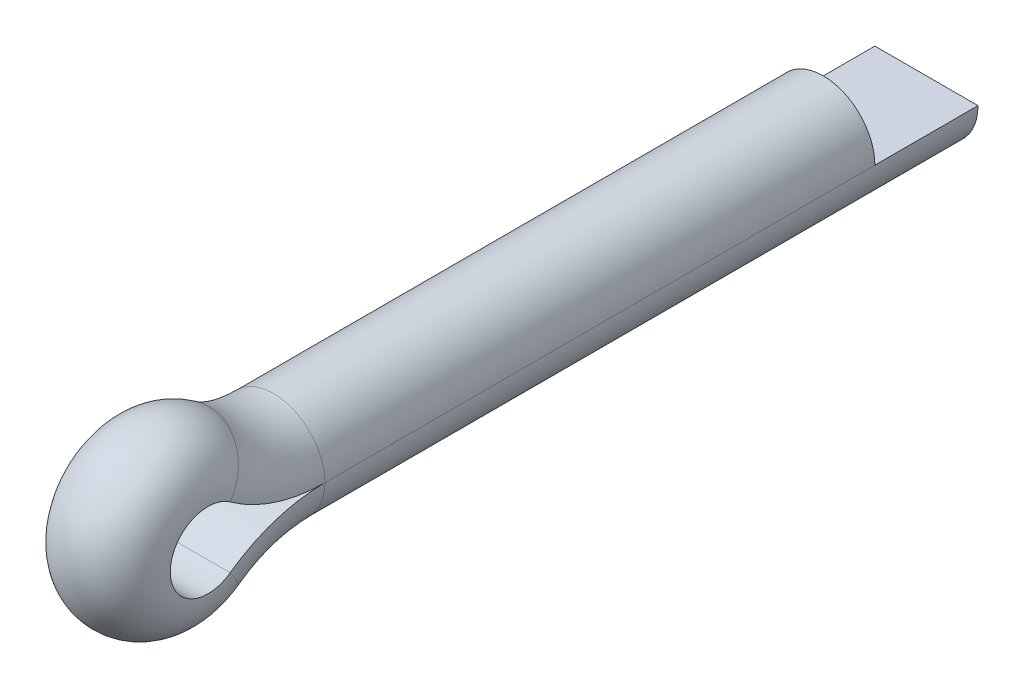
ISO-10303-21;
HEADER;
FILE_DESCRIPTION(('STEP AP214'),'2;1');
FILE_NAME('part.step','',(''),(''),'','','');
FILE_SCHEMA(('AUTOMOTIVE_DESIGN { 1 0 10303 214 1 1 1 1 }'));
ENDSEC;
DATA;
#1=APPLICATION_CONTEXT('core data for automotive mechanical design processes');
#2=APPLICATION_PROTOCOL_DEFINITION('international standard','automotive_design',2000,#1);
#3=PRODUCT_CONTEXT('',#1,'mechanical');
#4=PRODUCT('Part','Part','',(#3));
#5=PRODUCT_RELATED_PRODUCT_CATEGORY('part','',(#4));
#6=PRODUCT_DEFINITION_FORMATION('','',#4);
#7=PRODUCT_DEFINITION_CONTEXT('part definition',#1,'design');
#8=PRODUCT_DEFINITION('design','',#6,#7);
#9=PRODUCT_DEFINITION_SHAPE('','',#8);
#10=(LENGTH_UNIT() NAMED_UNIT(*) SI_UNIT(.MILLI.,.METRE.));
#11=(NAMED_UNIT(*) PLANE_ANGLE_UNIT() SI_UNIT($,.RADIAN.));
#12=(NAMED_UNIT(*) SI_UNIT($,.STERADIAN.) SOLID_ANGLE_UNIT());
#13=UNCERTAINTY_MEASURE_WITH_UNIT(LENGTH_MEASURE(1.E-05),#10,'distance_accuracy_value','');
#14=(GEOMETRIC_REPRESENTATION_CONTEXT(3) GLOBAL_UNCERTAINTY_ASSIGNED_CONTEXT((#13)) GLOBAL_UNIT_ASSIGNED_CONTEXT((#10,
#11,#12)) REPRESENTATION_CONTEXT('',''));
#15=CARTESIAN_POINT('',(0.,0.,0.));
#16=DIRECTION('',(0.,0.,1.));
#17=DIRECTION('',(1.,0.,0.));
#18=AXIS2_PLACEMENT_3D('',#15,#16,#17);
#19=CARTESIAN_POINT('',(0.,0.,-16.));
#20=DIRECTION('',(0.,0.,1.));
#21=DIRECTION('',(1.,0.,0.));
#22=AXIS2_PLACEMENT_3D('',#19,#20,#21);
#23=PLANE('',#22);
#24=CARTESIAN_POINT('',(0.,0.,-16.));
#25=DIRECTION('',(0.,0.,1.));
#26=DIRECTION('',(1.,0.,0.));
#27=AXIS2_PLACEMENT_3D('',#24,#25,#26);
#28=CIRCLE('',#27,1.5);
#29=CARTESIAN_POINT('',(1.5,0.,-16.));
#30=VERTEX_POINT('',#29);
#31=CARTESIAN_POINT('',(-1.5,0.,-16.));
#32=VERTEX_POINT('',#31);
#33=EDGE_CURVE('E93',#30,#32,#28,.T.);
#34=ORIENTED_EDGE('',*,*,#33,.F.);
#35=DIRECTION('',(1.,0.,0.));
#36=VECTOR('',#35,1.);
#37=CARTESIAN_POINT('',(-1.5,0.,-16.));
#38=LINE('',#37,#36);
#39=EDGE_CURVE('E88',#32,#30,#38,.T.);
#40=ORIENTED_EDGE('',*,*,#39,.F.);
#41=EDGE_LOOP('',(#34,#40));
#42=FACE_BOUND('',#41,.T.);
#43=ADVANCED_FACE('F36',(#42),#23,.F.);
#44=CARTESIAN_POINT('',(0.,0.,-19.));
#45=DIRECTION('',(0.,0.,-1.));
#46=DIRECTION('',(1.,0.,0.));
#47=AXIS2_PLACEMENT_3D('',#44,#45,#46);
#48=PLANE('',#47);
#49=CARTESIAN_POINT('',(0.,0.,-19.));
#50=DIRECTION('',(0.,0.,-1.));
#51=DIRECTION('',(1.,0.,0.));
#52=AXIS2_PLACEMENT_3D('',#49,#50,#51);
#53=CIRCLE('',#52,1.5);
#54=CARTESIAN_POINT('',(1.5,0.,-19.));
#55=VERTEX_POINT('',#54);
#56=CARTESIAN_POINT('',(-1.5,0.,-19.));
#57=VERTEX_POINT('',#56);
#58=EDGE_CURVE('E84',#55,#57,#53,.T.);
#59=ORIENTED_EDGE('',*,*,#58,.T.);
#60=DIRECTION('',(1.,0.,0.));
#61=VECTOR('',#60,1.);
#62=CARTESIAN_POINT('',(-1.5,0.,-19.));
#63=LINE('',#62,#61);
#64=EDGE_CURVE('E11',#57,#55,#63,.T.);
#65=ORIENTED_EDGE('',*,*,#64,.T.);
#66=EDGE_LOOP('',(#59,#65));
#67=FACE_BOUND('',#66,.T.);
#68=ADVANCED_FACE('F174',(#67),#48,.T.);
#69=CARTESIAN_POINT('',(0.,0.,-16.));
#70=DIRECTION('',(0.,0.,1.));
#71=DIRECTION('',(1.,0.,0.));
#72=AXIS2_PLACEMENT_3D('',#69,#70,#71);
#73=CYLINDRICAL_SURFACE('',#72,1.5);
#74=DIRECTION('',(0.,0.,1.));
#75=VECTOR('',#74,1.);
#76=CARTESIAN_POINT('',(-1.5,0.,-16.));
#77=LINE('',#76,#75);
#78=CARTESIAN_POINT('',(-1.5,0.,0.));
#79=VERTEX_POINT('',#78);
#80=EDGE_CURVE('E103',#32,#79,#77,.T.);
#81=ORIENTED_EDGE('',*,*,#80,.T.);
#82=CARTESIAN_POINT('',(0.,0.,0.));
#83=DIRECTION('',(0.,0.,1.));
#84=DIRECTION('',(1.,0.,0.));
#85=AXIS2_PLACEMENT_3D('',#82,#83,#84);
#86=CIRCLE('',#85,1.5);
#87=CARTESIAN_POINT('',(1.5,0.,0.));
#88=VERTEX_POINT('',#87);
#89=EDGE_CURVE('E101',#88,#79,#86,.T.);
#90=ORIENTED_EDGE('',*,*,#89,.F.);
#91=DIRECTION('',(0.,0.,1.));
#92=VECTOR('',#91,1.);
#93=CARTESIAN_POINT('',(1.5,0.,-16.));
#94=LINE('',#93,#92);
#95=EDGE_CURVE('E82',#30,#88,#94,.T.);
#96=ORIENTED_EDGE('',*,*,#95,.F.);
#97=ORIENTED_EDGE('',*,*,#33,.T.);
#98=EDGE_LOOP('',(#81,#90,#96,#97));
#99=FACE_BOUND('',#98,.T.);
#100=ADVANCED_FACE('F99',(#99),#73,.T.);
#101=CARTESIAN_POINT('',(0.,4.70454545454545,0.));
#102=DIRECTION('',(-1.,0.,0.));
#103=DIRECTION('',(0.,0.,1.));
#104=AXIS2_PLACEMENT_3D('',#101,#102,#103);
#105=TOROIDAL_SURFACE('',#104,4.70454545454545,1.5);
#106=CARTESIAN_POINT('',(-1.5,4.70454545454545,0.));
#107=DIRECTION('',(-1.,0.,0.));
#108=DIRECTION('',(0.,-1.,0.));
#109=AXIS2_PLACEMENT_3D('',#106,#107,#108);
#110=CIRCLE('',#109,4.70454545454545);
#111=CARTESIAN_POINT('',(-1.5,0.891542678151917,2.7556773688332));
#112=VERTEX_POINT('',#111);
#113=EDGE_CURVE('E110',#79,#112,#110,.T.);
#114=ORIENTED_EDGE('',*,*,#113,.T.);
#115=CARTESIAN_POINT('',(0.,0.891542678151919,2.7556773688332));
#116=DIRECTION('',(0.,0.585747846515271,0.810493343774471));
#117=DIRECTION('',(1.,0.,0.));
#118=AXIS2_PLACEMENT_3D('',#115,#116,#117);
#119=CIRCLE('',#118,1.5);
#120=CARTESIAN_POINT('',(1.5,0.891542678151917,2.7556773688332));
#121=VERTEX_POINT('',#120);
#122=EDGE_CURVE('E107',#121,#112,#119,.T.);
#123=ORIENTED_EDGE('',*,*,#122,.F.);
#124=CARTESIAN_POINT('',(1.5,4.70454545454545,0.));
#125=DIRECTION('',(-1.,0.,0.));
#126=DIRECTION('',(0.,-1.,0.));
#127=AXIS2_PLACEMENT_3D('',#124,#125,#126);
#128=CIRCLE('',#127,4.70454545454545);
#129=EDGE_CURVE('E111',#88,#121,#128,.T.);
#130=ORIENTED_EDGE('',*,*,#129,.F.);
#131=ORIENTED_EDGE('',*,*,#89,.T.);
#132=EDGE_LOOP('',(#114,#123,#130,#131));
#133=FACE_BOUND('',#132,.T.);
#134=ADVANCED_FACE('F156',(#133),#105,.T.);
#135=CARTESIAN_POINT('',(0.,4.70454545454545,0.));
#136=DIRECTION('',(-1.,0.,0.));
#137=DIRECTION('',(0.,0.,1.));
#138=AXIS2_PLACEMENT_3D('',#135,#136,#137);
#139=CYLINDRICAL_SURFACE('',#138,4.70454545454545);
#140=DIRECTION('',(1.,0.,0.));
#141=VECTOR('',#140,1.);
#142=CARTESIAN_POINT('',(-1.5,0.891542678151919,2.7556773688332));
#143=LINE('',#142,#141);
#144=EDGE_CURVE('E114',#112,#121,#143,.T.);
#145=ORIENTED_EDGE('',*,*,#144,.F.);
#146=ORIENTED_EDGE('',*,*,#113,.F.);
#147=DIRECTION('',(1.,0.,0.));
#148=VECTOR('',#147,1.);
#149=CARTESIAN_POINT('',(-1.5,0.,0.));
#150=LINE('',#149,#148);
#151=EDGE_CURVE('E117',#79,#88,#150,.T.);
#152=ORIENTED_EDGE('',*,*,#151,.T.);
#153=ORIENTED_EDGE('',*,*,#129,.T.);
#154=EDGE_LOOP('',(#145,#146,#152,#153));
#155=FACE_BOUND('',#154,.T.);
#156=ADVANCED_FACE('F157',(#155),#139,.T.);
#157=CARTESIAN_POINT('',(0.,0.,3.4));
#158=DIRECTION('',(1.,0.,0.));
#159=DIRECTION('',(0.,0.,-1.));
#160=AXIS2_PLACEMENT_3D('',#157,#158,#159);
#161=DEGENERATE_TOROIDAL_SURFACE('',#160,1.1,1.5,.T.);
#162=CARTESIAN_POINT('',(-1.5,0.,3.4));
#163=DIRECTION('',(1.,0.,0.));
#164=DIRECTION('',(0.,0.810493343774472,-0.58574784651527));
#165=AXIS2_PLACEMENT_3D('',#162,#163,#164);
#166=CIRCLE('',#165,1.1);
#167=CARTESIAN_POINT('',(-1.5,-0.891542678151918,2.7556773688332));
#168=VERTEX_POINT('',#167);
#169=EDGE_CURVE('E121',#112,#168,#166,.T.);
#170=ORIENTED_EDGE('',*,*,#169,.T.);
#171=CARTESIAN_POINT('',(0.,-0.891542678151919,2.7556773688332));
#172=DIRECTION('',(0.,0.585747846515271,-0.810493343774471));
#173=DIRECTION('',(1.,0.,0.));
#174=AXIS2_PLACEMENT_3D('',#171,#172,#173);
#175=CIRCLE('',#174,1.5);
#176=CARTESIAN_POINT('',(1.5,-0.891542678151918,2.7556773688332));
#177=VERTEX_POINT('',#176);
#178=EDGE_CURVE('E118',#177,#168,#175,.T.);
#179=ORIENTED_EDGE('',*,*,#178,.F.);
#180=CARTESIAN_POINT('',(1.5,0.,3.4));
#181=DIRECTION('',(1.,0.,0.));
#182=DIRECTION('',(0.,0.810493343774472,-0.58574784651527));
#183=AXIS2_PLACEMENT_3D('',#180,#181,#182);
#184=CIRCLE('',#183,1.1);
#185=EDGE_CURVE('E122',#121,#177,#184,.T.);
#186=ORIENTED_EDGE('',*,*,#185,.F.);
#187=ORIENTED_EDGE('',*,*,#122,.T.);
#188=EDGE_LOOP('',(#170,#179,#186,#187));
#189=FACE_BOUND('',#188,.T.);
#190=ADVANCED_FACE('F148',(#189),#161,.T.);
#191=CARTESIAN_POINT('',(0.,0.,3.4));
#192=DIRECTION('',(1.,0.,0.));
#193=DIRECTION('',(0.,0.,-1.));
#194=AXIS2_PLACEMENT_3D('',#191,#192,#193);
#195=CYLINDRICAL_SURFACE('',#194,1.1);
#196=DIRECTION('',(1.,0.,0.));
#197=VECTOR('',#196,1.);
#198=CARTESIAN_POINT('',(-1.5,-0.891542678151919,2.7556773688332));
#199=LINE('',#198,#197);
#200=EDGE_CURVE('E125',#168,#177,#199,.T.);
#201=ORIENTED_EDGE('',*,*,#200,.F.);
#202=ORIENTED_EDGE('',*,*,#169,.F.);
#203=ORIENTED_EDGE('',*,*,#144,.T.);
#204=ORIENTED_EDGE('',*,*,#185,.T.);
#205=EDGE_LOOP('',(#201,#202,#203,#204));
#206=FACE_BOUND('',#205,.T.);
#207=ADVANCED_FACE('F150',(#206),#195,.F.);
#208=CARTESIAN_POINT('',(0.,-4.70454545454545,0.));
#209=DIRECTION('',(-1.,0.,0.));
#210=DIRECTION('',(0.,0.,1.));
#211=AXIS2_PLACEMENT_3D('',#208,#209,#210);
#212=TOROIDAL_SURFACE('',#211,4.70454545454545,1.5);
#213=CARTESIAN_POINT('',(-1.5,-4.70454545454545,0.));
#214=DIRECTION('',(-1.,0.,0.));
#215=DIRECTION('',(0.,0.810493343774471,0.585747846515271));
#216=AXIS2_PLACEMENT_3D('',#213,#214,#215);
#217=CIRCLE('',#216,4.70454545454545);
#218=EDGE_CURVE('E85',#168,#79,#217,.T.);
#219=ORIENTED_EDGE('',*,*,#218,.T.);
#220=CARTESIAN_POINT('',(0.,0.,0.));
#221=DIRECTION('',(0.,0.,-1.));
#222=DIRECTION('',(1.,0.,0.));
#223=AXIS2_PLACEMENT_3D('',#220,#221,#222);
#224=CIRCLE('',#223,1.5);
#225=EDGE_CURVE('E128',#88,#79,#224,.T.);
#226=ORIENTED_EDGE('',*,*,#225,.F.);
#227=CARTESIAN_POINT('',(1.5,-4.70454545454545,0.));
#228=DIRECTION('',(-1.,0.,0.));
#229=DIRECTION('',(0.,0.810493343774471,0.585747846515271));
#230=AXIS2_PLACEMENT_3D('',#227,#228,#229);
#231=CIRCLE('',#230,4.70454545454545);
#232=EDGE_CURVE('E130',#177,#88,#231,.T.);
#233=ORIENTED_EDGE('',*,*,#232,.F.);
#234=ORIENTED_EDGE('',*,*,#178,.T.);
#235=EDGE_LOOP('',(#219,#226,#233,#234));
#236=FACE_BOUND('',#235,.T.);
#237=ADVANCED_FACE('F158',(#236),#212,.T.);
#238=CARTESIAN_POINT('',(0.,-4.70454545454545,0.));
#239=DIRECTION('',(-1.,0.,0.));
#240=DIRECTION('',(0.,0.,1.));
#241=AXIS2_PLACEMENT_3D('',#238,#239,#240);
#242=CYLINDRICAL_SURFACE('',#241,4.70454545454545);
#243=ORIENTED_EDGE('',*,*,#151,.F.);
#244=ORIENTED_EDGE('',*,*,#218,.F.);
#245=ORIENTED_EDGE('',*,*,#200,.T.);
#246=ORIENTED_EDGE('',*,*,#232,.T.);
#247=EDGE_LOOP('',(#243,#244,#245,#246));
#248=FACE_BOUND('',#247,.T.);
#249=ADVANCED_FACE('F144',(#248),#242,.T.);
#250=CARTESIAN_POINT('',(0.,0.,0.));
#251=DIRECTION('',(0.,0.,-1.));
#252=DIRECTION('',(-1.,0.,0.));
#253=AXIS2_PLACEMENT_3D('',#250,#251,#252);
#254=CYLINDRICAL_SURFACE('',#253,1.5);
#255=ORIENTED_EDGE('',*,*,#80,.F.);
#256=DIRECTION('',(0.,0.,-1.));
#257=VECTOR('',#256,1.);
#258=CARTESIAN_POINT('',(-1.5,0.,0.));
#259=LINE('',#258,#257);
#260=EDGE_CURVE('E43',#32,#57,#259,.T.);
#261=ORIENTED_EDGE('',*,*,#260,.T.);
#262=ORIENTED_EDGE('',*,*,#58,.F.);
#263=DIRECTION('',(0.,0.,-1.));
#264=VECTOR('',#263,1.);
#265=CARTESIAN_POINT('',(1.5,0.,0.));
#266=LINE('',#265,#264);
#267=EDGE_CURVE('E78',#30,#55,#266,.T.);
#268=ORIENTED_EDGE('',*,*,#267,.F.);
#269=ORIENTED_EDGE('',*,*,#95,.T.);
#270=ORIENTED_EDGE('',*,*,#225,.T.);
#271=EDGE_LOOP('',(#255,#261,#262,#268,#269,#270));
#272=FACE_BOUND('',#271,.T.);
#273=ADVANCED_FACE('F79',(#272),#254,.T.);
#274=CARTESIAN_POINT('',(-1.5,0.,0.));
#275=DIRECTION('',(0.,1.,0.));
#276=DIRECTION('',(0.,0.,1.));
#277=AXIS2_PLACEMENT_3D('',#274,#275,#276);
#278=PLANE('',#277);
#279=ORIENTED_EDGE('',*,*,#39,.T.);
#280=ORIENTED_EDGE('',*,*,#267,.T.);
#281=ORIENTED_EDGE('',*,*,#64,.F.);
#282=ORIENTED_EDGE('',*,*,#260,.F.);
#283=EDGE_LOOP('',(#279,#280,#281,#282));
#284=FACE_BOUND('',#283,.T.);
#285=ADVANCED_FACE('F90',(#284),#278,.T.);
#286=CLOSED_SHELL('',(#43,#68,#100,#134,#156,#190,#207,#237,#249,#273,#285));
#287=MANIFOLD_SOLID_BREP('B2',#286);
#288=ADVANCED_BREP_SHAPE_REPRESENTATION('',(#18,#287),#14);
#289=SHAPE_DEFINITION_REPRESENTATION(#9,#288);
ENDSEC;
END-ISO-10303-21;
